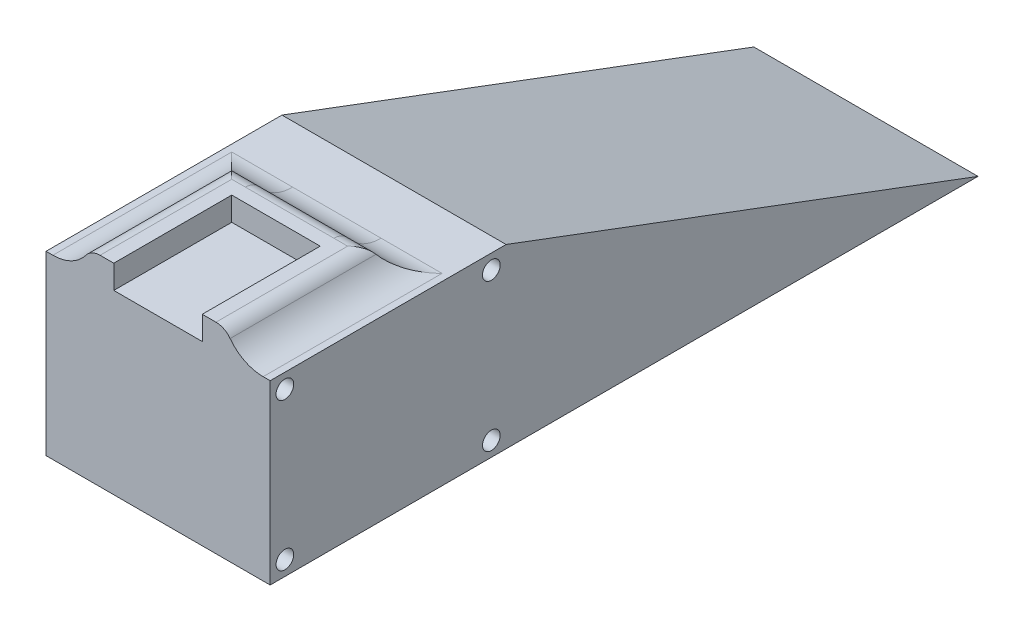
ISO-10303-21;
HEADER;
FILE_DESCRIPTION(('STEP AP214'),'2;1');
FILE_NAME('part.step','',(''),(''),'','','');
FILE_SCHEMA(('AUTOMOTIVE_DESIGN { 1 0 10303 214 1 1 1 1 }'));
ENDSEC;
DATA;
#1=APPLICATION_CONTEXT('core data for automotive mechanical design processes');
#2=APPLICATION_PROTOCOL_DEFINITION('international standard','automotive_design',2000,#1);
#3=PRODUCT_CONTEXT('',#1,'mechanical');
#4=PRODUCT('Part','Part','',(#3));
#5=PRODUCT_RELATED_PRODUCT_CATEGORY('part','',(#4));
#6=PRODUCT_DEFINITION_FORMATION('','',#4);
#7=PRODUCT_DEFINITION_CONTEXT('part definition',#1,'design');
#8=PRODUCT_DEFINITION('design','',#6,#7);
#9=PRODUCT_DEFINITION_SHAPE('','',#8);
#10=(LENGTH_UNIT() NAMED_UNIT(*) SI_UNIT(.MILLI.,.METRE.));
#11=(NAMED_UNIT(*) PLANE_ANGLE_UNIT() SI_UNIT($,.RADIAN.));
#12=(NAMED_UNIT(*) SI_UNIT($,.STERADIAN.) SOLID_ANGLE_UNIT());
#13=UNCERTAINTY_MEASURE_WITH_UNIT(LENGTH_MEASURE(1.E-05),#10,'distance_accuracy_value','');
#14=(GEOMETRIC_REPRESENTATION_CONTEXT(3) GLOBAL_UNCERTAINTY_ASSIGNED_CONTEXT((#13)) GLOBAL_UNIT_ASSIGNED_CONTEXT((#10,
#11,#12)) REPRESENTATION_CONTEXT('',''));
#15=CARTESIAN_POINT('',(0.,0.,0.));
#16=DIRECTION('',(0.,0.,1.));
#17=DIRECTION('',(1.,0.,0.));
#18=AXIS2_PLACEMENT_3D('',#15,#16,#17);
#19=CARTESIAN_POINT('',(38.,15.,20.));
#20=DIRECTION('',(0.,-1.,0.));
#21=DIRECTION('',(0.,0.,-1.));
#22=AXIS2_PLACEMENT_3D('',#19,#20,#21);
#23=PLANE('',#22);
#24=DIRECTION('',(1.,0.,0.));
#25=VECTOR('',#24,1.);
#26=CARTESIAN_POINT('',(26.4896490752853,15.,0.));
#27=LINE('',#26,#25);
#28=CARTESIAN_POINT('',(11.4896490752853,15.,0.));
#29=VERTEX_POINT('',#28);
#30=CARTESIAN_POINT('',(26.4896490752853,15.,0.));
#31=VERTEX_POINT('',#30);
#32=EDGE_CURVE('E179',#29,#31,#27,.T.);
#33=ORIENTED_EDGE('',*,*,#32,.F.);
#34=DIRECTION('',(0.,0.,1.));
#35=VECTOR('',#34,1.);
#36=CARTESIAN_POINT('',(11.4896490752853,15.,-4.));
#37=LINE('',#36,#35);
#38=CARTESIAN_POINT('',(11.4896490752853,15.,20.));
#39=VERTEX_POINT('',#38);
#40=EDGE_CURVE('E187',#29,#39,#37,.T.);
#41=ORIENTED_EDGE('',*,*,#40,.T.);
#42=DIRECTION('',(-1.,0.,0.));
#43=VECTOR('',#42,1.);
#44=CARTESIAN_POINT('',(38.,15.,20.));
#45=LINE('',#44,#43);
#46=CARTESIAN_POINT('',(26.4896490752853,15.,20.));
#47=VERTEX_POINT('',#46);
#48=EDGE_CURVE('E289',#47,#39,#45,.T.);
#49=ORIENTED_EDGE('',*,*,#48,.F.);
#50=DIRECTION('',(0.,0.,1.));
#51=VECTOR('',#50,1.);
#52=CARTESIAN_POINT('',(26.4896490752853,15.,-4.));
#53=LINE('',#52,#51);
#54=EDGE_CURVE('E399',#31,#47,#53,.T.);
#55=ORIENTED_EDGE('',*,*,#54,.F.);
#56=EDGE_LOOP('',(#33,#41,#49,#55));
#57=FACE_BOUND('',#56,.T.);
#58=ADVANCED_FACE('F47',(#57),#23,.F.);
#59=DIRECTION('',(-1.,0.,0.));
#60=VECTOR('',#59,1.);
#61=CARTESIAN_POINT('',(38.,15.,-10.3245553203368));
#62=LINE('',#61,#60);
#63=CARTESIAN_POINT('',(1.16509375494853,15.,-10.3245553203368));
#64=VERTEX_POINT('',#63);
#65=CARTESIAN_POINT('',(11.4896490752853,15.,-10.3245553203368));
#66=VERTEX_POINT('',#65);
#67=EDGE_CURVE('E316',#64,#66,#62,.F.);
#68=ORIENTED_EDGE('',*,*,#67,.T.);
#69=DIRECTION('',(-1.,0.,0.));
#70=VECTOR('',#69,1.);
#71=CARTESIAN_POINT('',(38.,15.,-10.3245553203368));
#72=LINE('',#71,#70);
#73=CARTESIAN_POINT('',(26.4896490752853,15.,-10.3245553203368));
#74=VERTEX_POINT('',#73);
#75=EDGE_CURVE('E332',#66,#74,#72,.F.);
#76=ORIENTED_EDGE('',*,*,#75,.T.);
#77=DIRECTION('',(1.,0.,0.));
#78=VECTOR('',#77,1.);
#79=CARTESIAN_POINT('',(38.,15.,-10.3245553203368));
#80=LINE('',#79,#78);
#81=CARTESIAN_POINT('',(36.814204395622,15.,-10.3245553203368));
#82=VERTEX_POINT('',#81);
#83=EDGE_CURVE('E312',#74,#82,#80,.T.);
#84=ORIENTED_EDGE('',*,*,#83,.T.);
#85=DIRECTION('',(0.,0.,1.));
#86=VECTOR('',#85,1.);
#87=CARTESIAN_POINT('',(36.814204395622,15.,20.));
#88=LINE('',#87,#86);
#89=CARTESIAN_POINT('',(36.814204395622,15.,20.));
#90=VERTEX_POINT('',#89);
#91=EDGE_CURVE('E301',#82,#90,#88,.T.);
#92=ORIENTED_EDGE('',*,*,#91,.T.);
#93=CARTESIAN_POINT('',(38.,15.,20.));
#94=VERTEX_POINT('',#93);
#95=EDGE_CURVE('E284',#94,#90,#45,.T.);
#96=ORIENTED_EDGE('',*,*,#95,.F.);
#97=DIRECTION('',(0.,0.,1.));
#98=VECTOR('',#97,1.);
#99=CARTESIAN_POINT('',(38.,15.,20.));
#100=LINE('',#99,#98);
#101=CARTESIAN_POINT('',(38.,15.,-20.));
#102=VERTEX_POINT('',#101);
#103=EDGE_CURVE('E261',#102,#94,#100,.T.);
#104=ORIENTED_EDGE('',*,*,#103,.F.);
#105=DIRECTION('',(-1.,0.,0.));
#106=VECTOR('',#105,1.);
#107=CARTESIAN_POINT('',(38.,15.,-20.));
#108=LINE('',#107,#106);
#109=CARTESIAN_POINT('',(0.,15.,-20.));
#110=VERTEX_POINT('',#109);
#111=EDGE_CURVE('E288',#102,#110,#108,.T.);
#112=ORIENTED_EDGE('',*,*,#111,.T.);
#113=DIRECTION('',(0.,0.,1.));
#114=VECTOR('',#113,1.);
#115=CARTESIAN_POINT('',(0.,15.,20.));
#116=LINE('',#115,#114);
#117=CARTESIAN_POINT('',(0.,15.,20.));
#118=VERTEX_POINT('',#117);
#119=EDGE_CURVE('E271',#110,#118,#116,.T.);
#120=ORIENTED_EDGE('',*,*,#119,.T.);
#121=CARTESIAN_POINT('',(1.16509375494853,15.,20.));
#122=VERTEX_POINT('',#121);
#123=EDGE_CURVE('E283',#122,#118,#45,.T.);
#124=ORIENTED_EDGE('',*,*,#123,.F.);
#125=DIRECTION('',(0.,0.,-1.));
#126=VECTOR('',#125,1.);
#127=CARTESIAN_POINT('',(1.16509375494853,15.,20.));
#128=LINE('',#127,#126);
#129=EDGE_CURVE('E297',#122,#64,#128,.T.);
#130=ORIENTED_EDGE('',*,*,#129,.T.);
#131=EDGE_LOOP('',(#68,#76,#84,#92,#96,#104,#112,#120,#124,#130));
#132=FACE_BOUND('',#131,.T.);
#133=ADVANCED_FACE('F422',(#132),#23,.F.);
#134=CARTESIAN_POINT('',(11.4896490752853,0.,-4.));
#135=DIRECTION('',(1.,0.,0.));
#136=DIRECTION('',(0.,0.,-1.));
#137=AXIS2_PLACEMENT_3D('',#134,#135,#136);
#138=PLANE('',#137);
#139=ORIENTED_EDGE('',*,*,#40,.F.);
#140=DIRECTION('',(0.,-1.,0.));
#141=VECTOR('',#140,1.);
#142=CARTESIAN_POINT('',(11.4896490752853,19.,0.));
#143=LINE('',#142,#141);
#144=CARTESIAN_POINT('',(11.4896490752853,19.,0.));
#145=VERTEX_POINT('',#144);
#146=EDGE_CURVE('E171',#145,#29,#143,.T.);
#147=ORIENTED_EDGE('',*,*,#146,.F.);
#148=DIRECTION('',(0.,0.,1.));
#149=VECTOR('',#148,1.);
#150=CARTESIAN_POINT('',(11.4896490752853,19.,-4.));
#151=LINE('',#150,#149);
#152=CARTESIAN_POINT('',(11.4896490752853,19.,20.));
#153=VERTEX_POINT('',#152);
#154=EDGE_CURVE('E185',#145,#153,#151,.T.);
#155=ORIENTED_EDGE('',*,*,#154,.T.);
#156=DIRECTION('',(0.,1.,0.));
#157=VECTOR('',#156,1.);
#158=CARTESIAN_POINT('',(11.4896490752853,0.,20.));
#159=LINE('',#158,#157);
#160=EDGE_CURVE('E204',#39,#153,#159,.T.);
#161=ORIENTED_EDGE('',*,*,#160,.F.);
#162=EDGE_LOOP('',(#139,#147,#155,#161));
#163=FACE_BOUND('',#162,.T.);
#164=ADVANCED_FACE('F183',(#163),#138,.T.);
#165=CARTESIAN_POINT('',(26.4896490752853,0.,-4.));
#166=DIRECTION('',(1.,0.,0.));
#167=DIRECTION('',(0.,0.,-1.));
#168=AXIS2_PLACEMENT_3D('',#165,#166,#167);
#169=PLANE('',#168);
#170=DIRECTION('',(0.,-1.,0.));
#171=VECTOR('',#170,1.);
#172=CARTESIAN_POINT('',(26.4896490752853,19.,0.));
#173=LINE('',#172,#171);
#174=CARTESIAN_POINT('',(26.4896490752853,19.,0.));
#175=VERTEX_POINT('',#174);
#176=EDGE_CURVE('E174',#175,#31,#173,.T.);
#177=ORIENTED_EDGE('',*,*,#176,.T.);
#178=ORIENTED_EDGE('',*,*,#54,.T.);
#179=DIRECTION('',(0.,1.,0.));
#180=VECTOR('',#179,1.);
#181=CARTESIAN_POINT('',(26.4896490752853,0.,20.));
#182=LINE('',#181,#180);
#183=CARTESIAN_POINT('',(26.4896490752853,19.,20.));
#184=VERTEX_POINT('',#183);
#185=EDGE_CURVE('E394',#47,#184,#182,.T.);
#186=ORIENTED_EDGE('',*,*,#185,.T.);
#187=DIRECTION('',(0.,0.,1.));
#188=VECTOR('',#187,1.);
#189=CARTESIAN_POINT('',(26.4896490752853,19.,-4.));
#190=LINE('',#189,#188);
#191=EDGE_CURVE('E398',#175,#184,#190,.T.);
#192=ORIENTED_EDGE('',*,*,#191,.F.);
#193=EDGE_LOOP('',(#177,#178,#186,#192));
#194=FACE_BOUND('',#193,.T.);
#195=ADVANCED_FACE('F482',(#194),#169,.F.);
#196=CARTESIAN_POINT('',(38.,15.,-20.));
#197=DIRECTION('',(0.,-0.936329177569045,0.351123441588391));
#198=DIRECTION('',(0.,-0.351123441588392,-0.936329177569045));
#199=AXIS2_PLACEMENT_3D('',#196,#197,#198);
#200=PLANE('',#199);
#201=DIRECTION('',(0.,0.351123441588391,0.936329177569045));
#202=VECTOR('',#201,1.);
#203=CARTESIAN_POINT('',(0.,15.,-20.));
#204=LINE('',#203,#202);
#205=CARTESIAN_POINT('',(0.,-15.,-100.));
#206=VERTEX_POINT('',#205);
#207=EDGE_CURVE('E252',#206,#110,#204,.T.);
#208=ORIENTED_EDGE('',*,*,#207,.T.);
#209=ORIENTED_EDGE('',*,*,#111,.F.);
#210=DIRECTION('',(0.,0.351123441588391,0.936329177569045));
#211=VECTOR('',#210,1.);
#212=CARTESIAN_POINT('',(38.,15.,-20.));
#213=LINE('',#212,#211);
#214=CARTESIAN_POINT('',(38.,-15.,-100.));
#215=VERTEX_POINT('',#214);
#216=EDGE_CURVE('E257',#215,#102,#213,.T.);
#217=ORIENTED_EDGE('',*,*,#216,.F.);
#218=DIRECTION('',(-1.,0.,0.));
#219=VECTOR('',#218,1.);
#220=CARTESIAN_POINT('',(38.,-15.,-100.));
#221=LINE('',#220,#219);
#222=EDGE_CURVE('E293',#215,#206,#221,.T.);
#223=ORIENTED_EDGE('',*,*,#222,.T.);
#224=EDGE_LOOP('',(#208,#209,#217,#223));
#225=FACE_BOUND('',#224,.T.);
#226=ADVANCED_FACE('F479',(#225),#200,.F.);
#227=CARTESIAN_POINT('',(38.,15.,20.));
#228=DIRECTION('',(0.,0.,-1.));
#229=DIRECTION('',(0.,1.,0.));
#230=AXIS2_PLACEMENT_3D('',#227,#228,#229);
#231=PLANE('',#230);
#232=CARTESIAN_POINT('',(36.814204395622,22.,20.));
#233=DIRECTION('',(0.,0.,-1.));
#234=DIRECTION('',(0.,1.,0.));
#235=AXIS2_PLACEMENT_3D('',#232,#233,#234);
#236=CIRCLE('',#235,7.);
#237=CARTESIAN_POINT('',(31.214204395622,17.8,20.));
#238=VERTEX_POINT('',#237);
#239=EDGE_CURVE('E305',#90,#238,#236,.T.);
#240=ORIENTED_EDGE('',*,*,#239,.T.);
#241=CARTESIAN_POINT('',(28.814204395622,16.,20.));
#242=DIRECTION('',(0.,0.,-1.));
#243=DIRECTION('',(0.,1.,0.));
#244=AXIS2_PLACEMENT_3D('',#241,#242,#243);
#245=CIRCLE('',#244,3.);
#246=CARTESIAN_POINT('',(28.814204395622,19.,20.));
#247=VERTEX_POINT('',#246);
#248=EDGE_CURVE('E343',#238,#247,#245,.F.);
#249=ORIENTED_EDGE('',*,*,#248,.T.);
#250=DIRECTION('',(1.,0.,0.));
#251=VECTOR('',#250,1.);
#252=CARTESIAN_POINT('',(0.,19.,20.));
#253=LINE('',#252,#251);
#254=EDGE_CURVE('E189',#184,#247,#253,.T.);
#255=ORIENTED_EDGE('',*,*,#254,.F.);
#256=ORIENTED_EDGE('',*,*,#185,.F.);
#257=ORIENTED_EDGE('',*,*,#48,.T.);
#258=ORIENTED_EDGE('',*,*,#160,.T.);
#259=DIRECTION('',(-1.,0.,0.));
#260=VECTOR('',#259,1.);
#261=CARTESIAN_POINT('',(0.,19.,20.));
#262=LINE('',#261,#260);
#263=CARTESIAN_POINT('',(9.16509375494853,19.,20.));
#264=VERTEX_POINT('',#263);
#265=EDGE_CURVE('E194',#153,#264,#262,.T.);
#266=ORIENTED_EDGE('',*,*,#265,.T.);
#267=CARTESIAN_POINT('',(9.16509375494853,16.,20.));
#268=DIRECTION('',(0.,0.,-1.));
#269=DIRECTION('',(0.,1.,0.));
#270=AXIS2_PLACEMENT_3D('',#267,#268,#269);
#271=CIRCLE('',#270,3.);
#272=CARTESIAN_POINT('',(6.76509375494853,17.8,20.));
#273=VERTEX_POINT('',#272);
#274=EDGE_CURVE('E340',#264,#273,#271,.F.);
#275=ORIENTED_EDGE('',*,*,#274,.T.);
#276=CARTESIAN_POINT('',(1.16509375494853,22.,20.));
#277=DIRECTION('',(0.,0.,-1.));
#278=DIRECTION('',(0.,1.,0.));
#279=AXIS2_PLACEMENT_3D('',#276,#277,#278);
#280=CIRCLE('',#279,7.);
#281=EDGE_CURVE('E309',#273,#122,#280,.T.);
#282=ORIENTED_EDGE('',*,*,#281,.T.);
#283=ORIENTED_EDGE('',*,*,#123,.T.);
#284=DIRECTION('',(0.,-1.,0.));
#285=VECTOR('',#284,1.);
#286=CARTESIAN_POINT('',(0.,15.,20.));
#287=LINE('',#286,#285);
#288=CARTESIAN_POINT('',(0.,-15.,20.));
#289=VERTEX_POINT('',#288);
#290=EDGE_CURVE('E275',#118,#289,#287,.T.);
#291=ORIENTED_EDGE('',*,*,#290,.T.);
#292=DIRECTION('',(-1.,0.,0.));
#293=VECTOR('',#292,1.);
#294=CARTESIAN_POINT('',(38.,-15.,20.));
#295=LINE('',#294,#293);
#296=CARTESIAN_POINT('',(38.,-15.,20.));
#297=VERTEX_POINT('',#296);
#298=EDGE_CURVE('E268',#297,#289,#295,.T.);
#299=ORIENTED_EDGE('',*,*,#298,.F.);
#300=DIRECTION('',(0.,-1.,0.));
#301=VECTOR('',#300,1.);
#302=CARTESIAN_POINT('',(38.,15.,20.));
#303=LINE('',#302,#301);
#304=EDGE_CURVE('E264',#94,#297,#303,.T.);
#305=ORIENTED_EDGE('',*,*,#304,.F.);
#306=ORIENTED_EDGE('',*,*,#95,.T.);
#307=EDGE_LOOP('',(#240,#249,#255,#256,#257,#258,#266,#275,#282,#283,#291,#299,#305,#306));
#308=FACE_BOUND('',#307,.T.);
#309=ADVANCED_FACE('F408',(#308),#231,.F.);
#310=CARTESIAN_POINT('',(38.,-15.,20.));
#311=DIRECTION('',(0.,1.,0.));
#312=DIRECTION('',(0.,0.,1.));
#313=AXIS2_PLACEMENT_3D('',#310,#311,#312);
#314=PLANE('',#313);
#315=DIRECTION('',(0.,0.,-1.));
#316=VECTOR('',#315,1.);
#317=CARTESIAN_POINT('',(0.,-15.,20.));
#318=LINE('',#317,#316);
#319=EDGE_CURVE('E258',#289,#206,#318,.T.);
#320=ORIENTED_EDGE('',*,*,#319,.T.);
#321=ORIENTED_EDGE('',*,*,#222,.F.);
#322=DIRECTION('',(0.,0.,-1.));
#323=VECTOR('',#322,1.);
#324=CARTESIAN_POINT('',(38.,-15.,-100.));
#325=LINE('',#324,#323);
#326=EDGE_CURVE('E253',#297,#215,#325,.T.);
#327=ORIENTED_EDGE('',*,*,#326,.F.);
#328=ORIENTED_EDGE('',*,*,#298,.T.);
#329=EDGE_LOOP('',(#320,#321,#327,#328));
#330=FACE_BOUND('',#329,.T.);
#331=ADVANCED_FACE('F431',(#330),#314,.F.);
#332=CARTESIAN_POINT('',(38.,0.,0.));
#333=DIRECTION('',(1.,0.,0.));
#334=DIRECTION('',(0.,0.,-1.));
#335=AXIS2_PLACEMENT_3D('',#332,#333,#334);
#336=PLANE('',#335);
#337=CARTESIAN_POINT('',(38.,12.5,-17.5));
#338=DIRECTION('',(-1.,0.,0.));
#339=DIRECTION('',(0.,0.,1.));
#340=AXIS2_PLACEMENT_3D('',#337,#338,#339);
#341=CIRCLE('',#340,1.49999999999999);
#342=CARTESIAN_POINT('',(38.,12.5,-16.));
#343=VERTEX_POINT('',#342);
#344=EDGE_CURVE('E212',#343,#343,#341,.T.);
#345=ORIENTED_EDGE('',*,*,#344,.T.);
#346=EDGE_LOOP('',(#345));
#347=FACE_BOUND('',#346,.T.);
#348=CARTESIAN_POINT('',(38.,-12.5,-17.5));
#349=DIRECTION('',(-1.,0.,0.));
#350=DIRECTION('',(0.,0.,1.));
#351=AXIS2_PLACEMENT_3D('',#348,#349,#350);
#352=CIRCLE('',#351,1.49999999999999);
#353=CARTESIAN_POINT('',(38.,-12.5,-16.));
#354=VERTEX_POINT('',#353);
#355=EDGE_CURVE('E224',#354,#354,#352,.T.);
#356=ORIENTED_EDGE('',*,*,#355,.T.);
#357=EDGE_LOOP('',(#356));
#358=FACE_BOUND('',#357,.T.);
#359=CARTESIAN_POINT('',(38.,-12.5,17.5));
#360=DIRECTION('',(-1.,0.,0.));
#361=DIRECTION('',(0.,0.,1.));
#362=AXIS2_PLACEMENT_3D('',#359,#360,#361);
#363=CIRCLE('',#362,1.49999999999999);
#364=CARTESIAN_POINT('',(38.,-12.5,19.));
#365=VERTEX_POINT('',#364);
#366=EDGE_CURVE('E236',#365,#365,#363,.T.);
#367=ORIENTED_EDGE('',*,*,#366,.T.);
#368=EDGE_LOOP('',(#367));
#369=FACE_BOUND('',#368,.T.);
#370=CARTESIAN_POINT('',(38.,12.5,17.5));
#371=DIRECTION('',(-1.,0.,0.));
#372=DIRECTION('',(0.,0.,1.));
#373=AXIS2_PLACEMENT_3D('',#370,#371,#372);
#374=CIRCLE('',#373,1.49999999999999);
#375=CARTESIAN_POINT('',(38.,12.5,19.));
#376=VERTEX_POINT('',#375);
#377=EDGE_CURVE('E248',#376,#376,#374,.T.);
#378=ORIENTED_EDGE('',*,*,#377,.T.);
#379=EDGE_LOOP('',(#378));
#380=FACE_BOUND('',#379,.T.);
#381=ORIENTED_EDGE('',*,*,#326,.T.);
#382=ORIENTED_EDGE('',*,*,#216,.T.);
#383=ORIENTED_EDGE('',*,*,#103,.T.);
#384=ORIENTED_EDGE('',*,*,#304,.T.);
#385=EDGE_LOOP('',(#381,#382,#383,#384));
#386=FACE_BOUND('',#385,.T.);
#387=ADVANCED_FACE('F435',(#347,#358,#369,#380,#386),#336,.T.);
#388=CARTESIAN_POINT('',(0.,0.,0.));
#389=DIRECTION('',(1.,0.,0.));
#390=DIRECTION('',(0.,0.,-1.));
#391=AXIS2_PLACEMENT_3D('',#388,#389,#390);
#392=PLANE('',#391);
#393=CARTESIAN_POINT('',(0.,12.5,-17.5));
#394=DIRECTION('',(-1.,0.,0.));
#395=DIRECTION('',(0.,0.,1.));
#396=AXIS2_PLACEMENT_3D('',#393,#394,#395);
#397=CIRCLE('',#396,1.525);
#398=CARTESIAN_POINT('',(0.,12.5,-15.975));
#399=VERTEX_POINT('',#398);
#400=EDGE_CURVE('E197',#399,#399,#397,.T.);
#401=ORIENTED_EDGE('',*,*,#400,.F.);
#402=EDGE_LOOP('',(#401));
#403=FACE_BOUND('',#402,.T.);
#404=CARTESIAN_POINT('',(0.,-12.5,-17.5));
#405=DIRECTION('',(-1.,0.,0.));
#406=DIRECTION('',(0.,0.,1.));
#407=AXIS2_PLACEMENT_3D('',#404,#405,#406);
#408=CIRCLE('',#407,1.525);
#409=CARTESIAN_POINT('',(0.,-12.5,-15.975));
#410=VERTEX_POINT('',#409);
#411=EDGE_CURVE('E216',#410,#410,#408,.T.);
#412=ORIENTED_EDGE('',*,*,#411,.F.);
#413=EDGE_LOOP('',(#412));
#414=FACE_BOUND('',#413,.T.);
#415=CARTESIAN_POINT('',(0.,-12.5,17.5));
#416=DIRECTION('',(-1.,0.,0.));
#417=DIRECTION('',(0.,0.,1.));
#418=AXIS2_PLACEMENT_3D('',#415,#416,#417);
#419=CIRCLE('',#418,1.525);
#420=CARTESIAN_POINT('',(0.,-12.5,19.025));
#421=VERTEX_POINT('',#420);
#422=EDGE_CURVE('E228',#421,#421,#419,.T.);
#423=ORIENTED_EDGE('',*,*,#422,.F.);
#424=EDGE_LOOP('',(#423));
#425=FACE_BOUND('',#424,.T.);
#426=CARTESIAN_POINT('',(0.,12.5,17.5));
#427=DIRECTION('',(-1.,0.,0.));
#428=DIRECTION('',(0.,0.,1.));
#429=AXIS2_PLACEMENT_3D('',#426,#427,#428);
#430=CIRCLE('',#429,1.525);
#431=CARTESIAN_POINT('',(0.,12.5,19.025));
#432=VERTEX_POINT('',#431);
#433=EDGE_CURVE('E240',#432,#432,#430,.T.);
#434=ORIENTED_EDGE('',*,*,#433,.F.);
#435=EDGE_LOOP('',(#434));
#436=FACE_BOUND('',#435,.T.);
#437=ORIENTED_EDGE('',*,*,#207,.F.);
#438=ORIENTED_EDGE('',*,*,#319,.F.);
#439=ORIENTED_EDGE('',*,*,#290,.F.);
#440=ORIENTED_EDGE('',*,*,#119,.F.);
#441=EDGE_LOOP('',(#437,#438,#439,#440));
#442=FACE_BOUND('',#441,.T.);
#443=ADVANCED_FACE('F428',(#403,#414,#425,#436,#442),#392,.F.);
#444=CARTESIAN_POINT('',(0.,12.5,17.5));
#445=DIRECTION('',(-1.,0.,0.));
#446=DIRECTION('',(0.,0.,1.));
#447=AXIS2_PLACEMENT_3D('',#444,#445,#446);
#448=CYLINDRICAL_SURFACE('',#447,1.49999999999999);
#449=ORIENTED_EDGE('',*,*,#377,.F.);
#450=EDGE_LOOP('',(#449));
#451=FACE_BOUND('',#450,.T.);
#452=CARTESIAN_POINT('',(0.0250000000000042,12.5,17.5));
#453=DIRECTION('',(-1.,0.,0.));
#454=DIRECTION('',(0.,0.,1.));
#455=AXIS2_PLACEMENT_3D('',#452,#453,#454);
#456=CIRCLE('',#455,1.49999999999999);
#457=CARTESIAN_POINT('',(0.0250000000000042,12.5,19.));
#458=VERTEX_POINT('',#457);
#459=EDGE_CURVE('E244',#458,#458,#456,.T.);
#460=ORIENTED_EDGE('',*,*,#459,.T.);
#461=EDGE_LOOP('',(#460));
#462=FACE_BOUND('',#461,.T.);
#463=ADVANCED_FACE('F666',(#451,#462),#448,.F.);
#464=CARTESIAN_POINT('',(0.,12.5,17.5));
#465=DIRECTION('',(-1.,0.,0.));
#466=DIRECTION('',(0.,0.,1.));
#467=AXIS2_PLACEMENT_3D('',#464,#465,#466);
#468=CONICAL_SURFACE('',#467,1.525,0.785398163397483);
#469=ORIENTED_EDGE('',*,*,#459,.F.);
#470=EDGE_LOOP('',(#469));
#471=FACE_BOUND('',#470,.T.);
#472=ORIENTED_EDGE('',*,*,#433,.T.);
#473=EDGE_LOOP('',(#472));
#474=FACE_BOUND('',#473,.T.);
#475=ADVANCED_FACE('F657',(#471,#474),#468,.F.);
#476=CARTESIAN_POINT('',(0.,-12.5,17.5));
#477=DIRECTION('',(-1.,0.,0.));
#478=DIRECTION('',(0.,0.,1.));
#479=AXIS2_PLACEMENT_3D('',#476,#477,#478);
#480=CYLINDRICAL_SURFACE('',#479,1.49999999999999);
#481=ORIENTED_EDGE('',*,*,#366,.F.);
#482=EDGE_LOOP('',(#481));
#483=FACE_BOUND('',#482,.T.);
#484=CARTESIAN_POINT('',(0.0250000000000042,-12.5,17.5));
#485=DIRECTION('',(-1.,0.,0.));
#486=DIRECTION('',(0.,0.,1.));
#487=AXIS2_PLACEMENT_3D('',#484,#485,#486);
#488=CIRCLE('',#487,1.49999999999999);
#489=CARTESIAN_POINT('',(0.0250000000000042,-12.5,19.));
#490=VERTEX_POINT('',#489);
#491=EDGE_CURVE('E232',#490,#490,#488,.T.);
#492=ORIENTED_EDGE('',*,*,#491,.T.);
#493=EDGE_LOOP('',(#492));
#494=FACE_BOUND('',#493,.T.);
#495=ADVANCED_FACE('F648',(#483,#494),#480,.F.);
#496=CARTESIAN_POINT('',(0.,-12.5,17.5));
#497=DIRECTION('',(-1.,0.,0.));
#498=DIRECTION('',(0.,0.,1.));
#499=AXIS2_PLACEMENT_3D('',#496,#497,#498);
#500=CONICAL_SURFACE('',#499,1.525,0.785398163397483);
#501=ORIENTED_EDGE('',*,*,#491,.F.);
#502=EDGE_LOOP('',(#501));
#503=FACE_BOUND('',#502,.T.);
#504=ORIENTED_EDGE('',*,*,#422,.T.);
#505=EDGE_LOOP('',(#504));
#506=FACE_BOUND('',#505,.T.);
#507=ADVANCED_FACE('F639',(#503,#506),#500,.F.);
#508=CARTESIAN_POINT('',(0.,-12.5,-17.5));
#509=DIRECTION('',(-1.,0.,0.));
#510=DIRECTION('',(0.,0.,1.));
#511=AXIS2_PLACEMENT_3D('',#508,#509,#510);
#512=CYLINDRICAL_SURFACE('',#511,1.49999999999999);
#513=ORIENTED_EDGE('',*,*,#355,.F.);
#514=EDGE_LOOP('',(#513));
#515=FACE_BOUND('',#514,.T.);
#516=CARTESIAN_POINT('',(0.0250000000000042,-12.5,-17.5));
#517=DIRECTION('',(-1.,0.,0.));
#518=DIRECTION('',(0.,0.,1.));
#519=AXIS2_PLACEMENT_3D('',#516,#517,#518);
#520=CIRCLE('',#519,1.49999999999999);
#521=CARTESIAN_POINT('',(0.0250000000000042,-12.5,-16.));
#522=VERTEX_POINT('',#521);
#523=EDGE_CURVE('E220',#522,#522,#520,.T.);
#524=ORIENTED_EDGE('',*,*,#523,.T.);
#525=EDGE_LOOP('',(#524));
#526=FACE_BOUND('',#525,.T.);
#527=ADVANCED_FACE('F630',(#515,#526),#512,.F.);
#528=CARTESIAN_POINT('',(0.,-12.5,-17.5));
#529=DIRECTION('',(-1.,0.,0.));
#530=DIRECTION('',(0.,0.,1.));
#531=AXIS2_PLACEMENT_3D('',#528,#529,#530);
#532=CONICAL_SURFACE('',#531,1.525,0.785398163397483);
#533=ORIENTED_EDGE('',*,*,#523,.F.);
#534=EDGE_LOOP('',(#533));
#535=FACE_BOUND('',#534,.T.);
#536=ORIENTED_EDGE('',*,*,#411,.T.);
#537=EDGE_LOOP('',(#536));
#538=FACE_BOUND('',#537,.T.);
#539=ADVANCED_FACE('F621',(#535,#538),#532,.F.);
#540=CARTESIAN_POINT('',(0.,12.5,-17.5));
#541=DIRECTION('',(-1.,0.,0.));
#542=DIRECTION('',(0.,0.,1.));
#543=AXIS2_PLACEMENT_3D('',#540,#541,#542);
#544=CYLINDRICAL_SURFACE('',#543,1.49999999999999);
#545=ORIENTED_EDGE('',*,*,#344,.F.);
#546=EDGE_LOOP('',(#545));
#547=FACE_BOUND('',#546,.T.);
#548=CARTESIAN_POINT('',(0.0250000000000042,12.5,-17.5));
#549=DIRECTION('',(-1.,0.,0.));
#550=DIRECTION('',(0.,0.,1.));
#551=AXIS2_PLACEMENT_3D('',#548,#549,#550);
#552=CIRCLE('',#551,1.49999999999999);
#553=CARTESIAN_POINT('',(0.0250000000000042,12.5,-16.));
#554=VERTEX_POINT('',#553);
#555=EDGE_CURVE('E202',#554,#554,#552,.T.);
#556=ORIENTED_EDGE('',*,*,#555,.T.);
#557=EDGE_LOOP('',(#556));
#558=FACE_BOUND('',#557,.T.);
#559=ADVANCED_FACE('F611',(#547,#558),#544,.F.);
#560=CARTESIAN_POINT('',(0.,12.5,-17.5));
#561=DIRECTION('',(-1.,0.,0.));
#562=DIRECTION('',(0.,0.,1.));
#563=AXIS2_PLACEMENT_3D('',#560,#561,#562);
#564=CONICAL_SURFACE('',#563,1.525,0.785398163397483);
#565=ORIENTED_EDGE('',*,*,#555,.F.);
#566=EDGE_LOOP('',(#565));
#567=FACE_BOUND('',#566,.T.);
#568=ORIENTED_EDGE('',*,*,#400,.T.);
#569=EDGE_LOOP('',(#568));
#570=FACE_BOUND('',#569,.T.);
#571=ADVANCED_FACE('F603',(#567,#570),#564,.F.);
#572=CARTESIAN_POINT('',(0.,19.,-4.));
#573=DIRECTION('',(0.,1.,0.));
#574=DIRECTION('',(0.,0.,1.));
#575=AXIS2_PLACEMENT_3D('',#572,#573,#574);
#576=PLANE('',#575);
#577=ORIENTED_EDGE('',*,*,#254,.T.);
#578=DIRECTION('',(0.,0.,-1.));
#579=VECTOR('',#578,1.);
#580=CARTESIAN_POINT('',(28.814204395622,19.,-4.));
#581=LINE('',#580,#579);
#582=CARTESIAN_POINT('',(28.814204395622,19.,-2.32455532033676));
#583=VERTEX_POINT('',#582);
#584=EDGE_CURVE('E358',#247,#583,#581,.T.);
#585=ORIENTED_EDGE('',*,*,#584,.T.);
#586=DIRECTION('',(-1.,0.,0.));
#587=VECTOR('',#586,1.);
#588=CARTESIAN_POINT('',(26.4896490752853,19.,-2.32455532033676));
#589=LINE('',#588,#587);
#590=CARTESIAN_POINT('',(26.4896490752853,19.,-2.32455532033676));
#591=VERTEX_POINT('',#590);
#592=EDGE_CURVE('E355',#583,#591,#589,.T.);
#593=ORIENTED_EDGE('',*,*,#592,.T.);
#594=DIRECTION('',(1.,0.,0.));
#595=VECTOR('',#594,1.);
#596=CARTESIAN_POINT('',(11.4896490752853,19.,-2.32455532033676));
#597=LINE('',#596,#595);
#598=CARTESIAN_POINT('',(11.4896490752853,19.,-2.32455532033676));
#599=VERTEX_POINT('',#598);
#600=EDGE_CURVE('E352',#591,#599,#597,.F.);
#601=ORIENTED_EDGE('',*,*,#600,.T.);
#602=DIRECTION('',(1.,0.,0.));
#603=VECTOR('',#602,1.);
#604=CARTESIAN_POINT('',(7.48964907528529,19.,-2.32455532033676));
#605=LINE('',#604,#603);
#606=CARTESIAN_POINT('',(9.16509375494853,19.,-2.32455532033676));
#607=VERTEX_POINT('',#606);
#608=EDGE_CURVE('E349',#599,#607,#605,.F.);
#609=ORIENTED_EDGE('',*,*,#608,.T.);
#610=DIRECTION('',(0.,0.,1.));
#611=VECTOR('',#610,1.);
#612=CARTESIAN_POINT('',(9.16509375494853,19.,20.));
#613=LINE('',#612,#611);
#614=EDGE_CURVE('E346',#607,#264,#613,.T.);
#615=ORIENTED_EDGE('',*,*,#614,.T.);
#616=ORIENTED_EDGE('',*,*,#265,.F.);
#617=ORIENTED_EDGE('',*,*,#154,.F.);
#618=DIRECTION('',(1.,0.,0.));
#619=VECTOR('',#618,1.);
#620=CARTESIAN_POINT('',(26.4896490752853,19.,0.));
#621=LINE('',#620,#619);
#622=EDGE_CURVE('E168',#145,#175,#621,.T.);
#623=ORIENTED_EDGE('',*,*,#622,.T.);
#624=ORIENTED_EDGE('',*,*,#191,.T.);
#625=EDGE_LOOP('',(#577,#585,#593,#601,#609,#615,#616,#617,#623,#624));
#626=FACE_BOUND('',#625,.T.);
#627=ADVANCED_FACE('F192',(#626),#576,.T.);
#628=CARTESIAN_POINT('',(36.814204395622,22.,-4.));
#629=DIRECTION('',(0.,0.,1.));
#630=DIRECTION('',(1.,0.,0.));
#631=AXIS2_PLACEMENT_3D('',#628,#629,#630);
#632=CYLINDRICAL_SURFACE('',#631,7.);
#633=CARTESIAN_POINT('',(36.814204395622,22.,-10.3245553203368));
#634=DIRECTION('',(0.707106781186547,0.,0.707106781186547));
#635=DIRECTION('',(-0.707106781186547,0.,0.707106781186547));
#636=AXIS2_PLACEMENT_3D('',#633,#634,#635);
#637=ELLIPSE('',#636,9.89949493661167,7.);
#638=CARTESIAN_POINT('',(31.214204395622,17.8,-4.72455532033676));
#639=VERTEX_POINT('',#638);
#640=EDGE_CURVE('E328',#82,#639,#637,.F.);
#641=ORIENTED_EDGE('',*,*,#640,.T.);
#642=DIRECTION('',(0.,0.,1.));
#643=VECTOR('',#642,1.);
#644=CARTESIAN_POINT('',(31.214204395622,17.8,-4.));
#645=LINE('',#644,#643);
#646=EDGE_CURVE('E336',#639,#238,#645,.T.);
#647=ORIENTED_EDGE('',*,*,#646,.T.);
#648=ORIENTED_EDGE('',*,*,#239,.F.);
#649=ORIENTED_EDGE('',*,*,#91,.F.);
#650=EDGE_LOOP('',(#641,#647,#648,#649));
#651=FACE_BOUND('',#650,.T.);
#652=ADVANCED_FACE('F439',(#651),#632,.F.);
#653=CARTESIAN_POINT('',(1.16509375494853,22.,-4.));
#654=DIRECTION('',(0.,0.,-1.));
#655=DIRECTION('',(-1.,0.,0.));
#656=AXIS2_PLACEMENT_3D('',#653,#654,#655);
#657=CYLINDRICAL_SURFACE('',#656,7.);
#658=ORIENTED_EDGE('',*,*,#281,.F.);
#659=DIRECTION('',(0.,0.,-1.));
#660=VECTOR('',#659,1.);
#661=CARTESIAN_POINT('',(6.76509375494853,17.8,-4.));
#662=LINE('',#661,#660);
#663=CARTESIAN_POINT('',(6.76509375494853,17.8,-4.72455532033676));
#664=VERTEX_POINT('',#663);
#665=EDGE_CURVE('E11',#273,#664,#662,.T.);
#666=ORIENTED_EDGE('',*,*,#665,.T.);
#667=CARTESIAN_POINT('',(1.16509375494853,22.,-10.3245553203368));
#668=DIRECTION('',(0.707106781186547,0.,-0.707106781186547));
#669=DIRECTION('',(-0.707106781186547,0.,-0.707106781186547));
#670=AXIS2_PLACEMENT_3D('',#667,#668,#669);
#671=ELLIPSE('',#670,9.89949493661167,7.);
#672=EDGE_CURVE('E319',#664,#64,#671,.T.);
#673=ORIENTED_EDGE('',*,*,#672,.T.);
#674=ORIENTED_EDGE('',*,*,#129,.F.);
#675=EDGE_LOOP('',(#658,#666,#673,#674));
#676=FACE_BOUND('',#675,.T.);
#677=ADVANCED_FACE('F466',(#676),#657,.F.);
#678=CARTESIAN_POINT('',(0.,22.,-10.3245553203368));
#679=DIRECTION('',(-1.,0.,0.));
#680=DIRECTION('',(0.,0.,1.));
#681=AXIS2_PLACEMENT_3D('',#678,#679,#680);
#682=CYLINDRICAL_SURFACE('',#681,7.);
#683=ORIENTED_EDGE('',*,*,#672,.F.);
#684=DIRECTION('',(-1.,0.,0.));
#685=VECTOR('',#684,1.);
#686=CARTESIAN_POINT('',(0.,17.8,-4.72455532033676));
#687=LINE('',#686,#685);
#688=CARTESIAN_POINT('',(11.4896490752853,17.8,-4.72455532033676));
#689=VERTEX_POINT('',#688);
#690=EDGE_CURVE('E70',#664,#689,#687,.F.);
#691=ORIENTED_EDGE('',*,*,#690,.T.);
#692=CARTESIAN_POINT('',(11.4896490752853,22.,-10.3245553203368));
#693=DIRECTION('',(1.,0.,0.));
#694=DIRECTION('',(0.,0.,-1.));
#695=AXIS2_PLACEMENT_3D('',#692,#693,#694);
#696=CIRCLE('',#695,7.);
#697=EDGE_CURVE('E322',#66,#689,#696,.F.);
#698=ORIENTED_EDGE('',*,*,#697,.F.);
#699=ORIENTED_EDGE('',*,*,#67,.F.);
#700=EDGE_LOOP('',(#683,#691,#698,#699));
#701=FACE_BOUND('',#700,.T.);
#702=ADVANCED_FACE('F458',(#701),#682,.F.);
#703=CARTESIAN_POINT('',(0.,22.,-10.3245553203368));
#704=DIRECTION('',(1.,0.,0.));
#705=DIRECTION('',(0.,0.,-1.));
#706=AXIS2_PLACEMENT_3D('',#703,#704,#705);
#707=CYLINDRICAL_SURFACE('',#706,7.);
#708=CARTESIAN_POINT('',(26.4896490752853,22.,-10.3245553203368));
#709=DIRECTION('',(1.,0.,0.));
#710=DIRECTION('',(0.,0.,-1.));
#711=AXIS2_PLACEMENT_3D('',#708,#709,#710);
#712=CIRCLE('',#711,7.);
#713=CARTESIAN_POINT('',(26.4896490752853,17.8,-4.72455532033676));
#714=VERTEX_POINT('',#713);
#715=EDGE_CURVE('E325',#714,#74,#712,.T.);
#716=ORIENTED_EDGE('',*,*,#715,.F.);
#717=DIRECTION('',(1.,0.,0.));
#718=VECTOR('',#717,1.);
#719=CARTESIAN_POINT('',(0.,17.8,-4.72455532033676));
#720=LINE('',#719,#718);
#721=EDGE_CURVE('E361',#714,#639,#720,.T.);
#722=ORIENTED_EDGE('',*,*,#721,.T.);
#723=ORIENTED_EDGE('',*,*,#640,.F.);
#724=ORIENTED_EDGE('',*,*,#83,.F.);
#725=EDGE_LOOP('',(#716,#722,#723,#724));
#726=FACE_BOUND('',#725,.T.);
#727=ADVANCED_FACE('F456',(#726),#707,.F.);
#728=CARTESIAN_POINT('',(26.4896490752853,19.,0.));
#729=DIRECTION('',(0.,0.,-1.));
#730=DIRECTION('',(-1.,0.,0.));
#731=AXIS2_PLACEMENT_3D('',#728,#729,#730);
#732=PLANE('',#731);
#733=ORIENTED_EDGE('',*,*,#32,.T.);
#734=ORIENTED_EDGE('',*,*,#176,.F.);
#735=ORIENTED_EDGE('',*,*,#622,.F.);
#736=ORIENTED_EDGE('',*,*,#146,.T.);
#737=EDGE_LOOP('',(#733,#734,#735,#736));
#738=FACE_BOUND('',#737,.T.);
#739=ADVANCED_FACE('F170',(#738),#732,.F.);
#740=CARTESIAN_POINT('',(11.4896490752853,22.,-10.3245553203368));
#741=DIRECTION('',(-1.,0.,0.));
#742=DIRECTION('',(0.,0.,1.));
#743=AXIS2_PLACEMENT_3D('',#740,#741,#742);
#744=CYLINDRICAL_SURFACE('',#743,7.);
#745=ORIENTED_EDGE('',*,*,#697,.T.);
#746=DIRECTION('',(-1.,0.,0.));
#747=VECTOR('',#746,1.);
#748=CARTESIAN_POINT('',(11.4896490752853,17.8,-4.72455532033676));
#749=LINE('',#748,#747);
#750=EDGE_CURVE('E57',#689,#714,#749,.F.);
#751=ORIENTED_EDGE('',*,*,#750,.T.);
#752=ORIENTED_EDGE('',*,*,#715,.T.);
#753=ORIENTED_EDGE('',*,*,#75,.F.);
#754=EDGE_LOOP('',(#745,#751,#752,#753));
#755=FACE_BOUND('',#754,.T.);
#756=ADVANCED_FACE('F453',(#755),#744,.F.);
#757=CARTESIAN_POINT('',(9.16509375494853,16.,-4.));
#758=DIRECTION('',(0.,0.,-1.));
#759=DIRECTION('',(-1.,0.,0.));
#760=AXIS2_PLACEMENT_3D('',#757,#758,#759);
#761=CYLINDRICAL_SURFACE('',#760,3.);
#762=ORIENTED_EDGE('',*,*,#274,.F.);
#763=ORIENTED_EDGE('',*,*,#614,.F.);
#764=CARTESIAN_POINT('',(9.16509375494853,16.,-2.32455532033676));
#765=DIRECTION('',(0.707106781186547,0.,-0.707106781186547));
#766=DIRECTION('',(-0.707106781186547,0.,-0.707106781186547));
#767=AXIS2_PLACEMENT_3D('',#764,#765,#766);
#768=ELLIPSE('',#767,4.24264068711928,3.);
#769=EDGE_CURVE('E51',#664,#607,#768,.T.);
#770=ORIENTED_EDGE('',*,*,#769,.F.);
#771=ORIENTED_EDGE('',*,*,#665,.F.);
#772=EDGE_LOOP('',(#762,#763,#770,#771));
#773=FACE_BOUND('',#772,.T.);
#774=ADVANCED_FACE('F49',(#773),#761,.T.);
#775=CARTESIAN_POINT('',(0.,16.,-2.32455532033676));
#776=DIRECTION('',(-1.,0.,0.));
#777=DIRECTION('',(0.,0.,1.));
#778=AXIS2_PLACEMENT_3D('',#775,#776,#777);
#779=CYLINDRICAL_SURFACE('',#778,3.);
#780=ORIENTED_EDGE('',*,*,#769,.T.);
#781=ORIENTED_EDGE('',*,*,#608,.F.);
#782=CARTESIAN_POINT('',(11.4896490752853,16.,-2.32455532033676));
#783=DIRECTION('',(1.,0.,0.));
#784=DIRECTION('',(0.,0.,-1.));
#785=AXIS2_PLACEMENT_3D('',#782,#783,#784);
#786=CIRCLE('',#785,3.);
#787=EDGE_CURVE('E375',#689,#599,#786,.T.);
#788=ORIENTED_EDGE('',*,*,#787,.F.);
#789=ORIENTED_EDGE('',*,*,#690,.F.);
#790=EDGE_LOOP('',(#780,#781,#788,#789));
#791=FACE_BOUND('',#790,.T.);
#792=ADVANCED_FACE('F491',(#791),#779,.T.);
#793=CARTESIAN_POINT('',(11.4896490752853,16.,-2.32455532033676));
#794=DIRECTION('',(-1.,0.,0.));
#795=DIRECTION('',(0.,0.,1.));
#796=AXIS2_PLACEMENT_3D('',#793,#794,#795);
#797=CYLINDRICAL_SURFACE('',#796,3.);
#798=ORIENTED_EDGE('',*,*,#787,.T.);
#799=ORIENTED_EDGE('',*,*,#600,.F.);
#800=CARTESIAN_POINT('',(26.4896490752853,16.,-2.32455532033676));
#801=DIRECTION('',(1.,0.,0.));
#802=DIRECTION('',(0.,0.,-1.));
#803=AXIS2_PLACEMENT_3D('',#800,#801,#802);
#804=CIRCLE('',#803,3.);
#805=EDGE_CURVE('E372',#714,#591,#804,.T.);
#806=ORIENTED_EDGE('',*,*,#805,.F.);
#807=ORIENTED_EDGE('',*,*,#750,.F.);
#808=EDGE_LOOP('',(#798,#799,#806,#807));
#809=FACE_BOUND('',#808,.T.);
#810=ADVANCED_FACE('F450',(#809),#797,.T.);
#811=CARTESIAN_POINT('',(0.,16.,-2.32455532033676));
#812=DIRECTION('',(1.,0.,0.));
#813=DIRECTION('',(0.,0.,-1.));
#814=AXIS2_PLACEMENT_3D('',#811,#812,#813);
#815=CYLINDRICAL_SURFACE('',#814,3.);
#816=ORIENTED_EDGE('',*,*,#805,.T.);
#817=ORIENTED_EDGE('',*,*,#592,.F.);
#818=CARTESIAN_POINT('',(28.814204395622,16.,-2.32455532033676));
#819=DIRECTION('',(0.707106781186547,0.,0.707106781186547));
#820=DIRECTION('',(0.707106781186547,0.,-0.707106781186547));
#821=AXIS2_PLACEMENT_3D('',#818,#819,#820);
#822=ELLIPSE('',#821,4.24264068711928,3.);
#823=EDGE_CURVE('E368',#639,#583,#822,.T.);
#824=ORIENTED_EDGE('',*,*,#823,.F.);
#825=ORIENTED_EDGE('',*,*,#721,.F.);
#826=EDGE_LOOP('',(#816,#817,#824,#825));
#827=FACE_BOUND('',#826,.T.);
#828=ADVANCED_FACE('F448',(#827),#815,.T.);
#829=CARTESIAN_POINT('',(28.814204395622,16.,-4.));
#830=DIRECTION('',(0.,0.,1.));
#831=DIRECTION('',(1.,0.,0.));
#832=AXIS2_PLACEMENT_3D('',#829,#830,#831);
#833=CYLINDRICAL_SURFACE('',#832,3.);
#834=ORIENTED_EDGE('',*,*,#823,.T.);
#835=ORIENTED_EDGE('',*,*,#584,.F.);
#836=ORIENTED_EDGE('',*,*,#248,.F.);
#837=ORIENTED_EDGE('',*,*,#646,.F.);
#838=EDGE_LOOP('',(#834,#835,#836,#837));
#839=FACE_BOUND('',#838,.T.);
#840=ADVANCED_FACE('F445',(#839),#833,.T.);
#841=CLOSED_SHELL('',(#58,#133,#164,#195,#226,#309,#331,#387,#443,#463,#475,#495,#507,#527,#539,
#559,#571,#627,#652,#677,#702,#727,#739,#756,#774,#792,#810,#828,#840));
#842=MANIFOLD_SOLID_BREP('B2',#841);
#843=ADVANCED_BREP_SHAPE_REPRESENTATION('',(#18,#842),#14);
#844=SHAPE_DEFINITION_REPRESENTATION(#9,#843);
ENDSEC;
END-ISO-10303-21;
